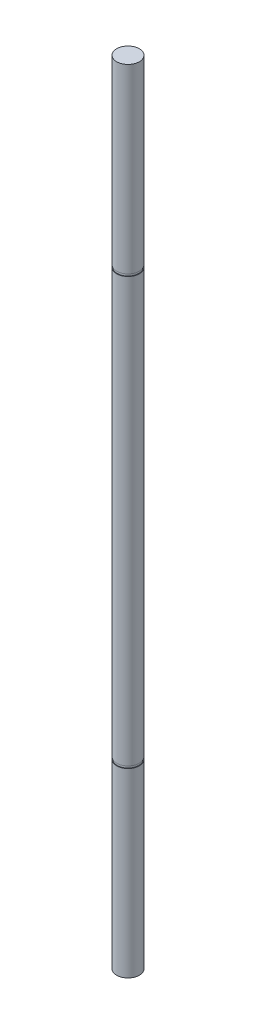
ISO-10303-21;
HEADER;
FILE_DESCRIPTION(('STEP AP214'),'2;1');
FILE_NAME('part.step','',(''),(''),'','','');
FILE_SCHEMA(('AUTOMOTIVE_DESIGN { 1 0 10303 214 1 1 1 1 }'));
ENDSEC;
DATA;
#1=APPLICATION_CONTEXT('core data for automotive mechanical design processes');
#2=APPLICATION_PROTOCOL_DEFINITION('international standard','automotive_design',2000,#1);
#3=PRODUCT_CONTEXT('',#1,'mechanical');
#4=PRODUCT('Part','Part','',(#3));
#5=PRODUCT_RELATED_PRODUCT_CATEGORY('part','',(#4));
#6=PRODUCT_DEFINITION_FORMATION('','',#4);
#7=PRODUCT_DEFINITION_CONTEXT('part definition',#1,'design');
#8=PRODUCT_DEFINITION('design','',#6,#7);
#9=PRODUCT_DEFINITION_SHAPE('','',#8);
#10=(LENGTH_UNIT() NAMED_UNIT(*) SI_UNIT(.MILLI.,.METRE.));
#11=(NAMED_UNIT(*) PLANE_ANGLE_UNIT() SI_UNIT($,.RADIAN.));
#12=(NAMED_UNIT(*) SI_UNIT($,.STERADIAN.) SOLID_ANGLE_UNIT());
#13=UNCERTAINTY_MEASURE_WITH_UNIT(LENGTH_MEASURE(1.E-05),#10,'distance_accuracy_value','');
#14=(GEOMETRIC_REPRESENTATION_CONTEXT(3) GLOBAL_UNCERTAINTY_ASSIGNED_CONTEXT((#13)) GLOBAL_UNIT_ASSIGNED_CONTEXT((#10,
#11,#12)) REPRESENTATION_CONTEXT('',''));
#15=CARTESIAN_POINT('',(0.,0.,0.));
#16=DIRECTION('',(0.,0.,1.));
#17=DIRECTION('',(1.,0.,0.));
#18=AXIS2_PLACEMENT_3D('',#15,#16,#17);
#19=CARTESIAN_POINT('',(0.,140.,0.));
#20=DIRECTION('',(0.,-1.,0.));
#21=DIRECTION('',(0.,0.,-1.));
#22=AXIS2_PLACEMENT_3D('',#19,#20,#21);
#23=CYLINDRICAL_SURFACE('',#22,4.);
#24=CARTESIAN_POINT('',(0.,75.,0.));
#25=DIRECTION('',(0.,1.,0.));
#26=DIRECTION('',(0.,0.,1.));
#27=AXIS2_PLACEMENT_3D('',#24,#25,#26);
#28=CIRCLE('',#27,4.);
#29=CARTESIAN_POINT('',(0.,75.,4.));
#30=VERTEX_POINT('',#29);
#31=EDGE_CURVE('E54',#30,#30,#28,.T.);
#32=ORIENTED_EDGE('',*,*,#31,.F.);
#33=EDGE_LOOP('',(#32));
#34=FACE_BOUND('',#33,.T.);
#35=CARTESIAN_POINT('',(0.,-75.,0.));
#36=DIRECTION('',(0.,-1.,0.));
#37=DIRECTION('',(0.,0.,-1.));
#38=AXIS2_PLACEMENT_3D('',#35,#36,#37);
#39=CIRCLE('',#38,4.);
#40=CARTESIAN_POINT('',(0.,-75.,-4.));
#41=VERTEX_POINT('',#40);
#42=EDGE_CURVE('E58',#41,#41,#39,.T.);
#43=ORIENTED_EDGE('',*,*,#42,.F.);
#44=EDGE_LOOP('',(#43));
#45=FACE_BOUND('',#44,.T.);
#46=ADVANCED_FACE('F35',(#34,#45),#23,.T.);
#47=CARTESIAN_POINT('',(0.,140.,0.));
#48=DIRECTION('',(0.,1.,0.));
#49=DIRECTION('',(0.,0.,1.));
#50=AXIS2_PLACEMENT_3D('',#47,#48,#49);
#51=CIRCLE('',#50,4.);
#52=CARTESIAN_POINT('',(0.,140.,4.));
#53=VERTEX_POINT('',#52);
#54=EDGE_CURVE('E10',#53,#53,#51,.T.);
#55=ORIENTED_EDGE('',*,*,#54,.F.);
#56=EDGE_LOOP('',(#55));
#57=FACE_BOUND('',#56,.T.);
#58=CARTESIAN_POINT('',(0.,75.8,0.));
#59=DIRECTION('',(0.,-1.,0.));
#60=DIRECTION('',(0.,0.,-1.));
#61=AXIS2_PLACEMENT_3D('',#58,#59,#60);
#62=CIRCLE('',#61,4.);
#63=CARTESIAN_POINT('',(0.,75.8,-4.));
#64=VERTEX_POINT('',#63);
#65=EDGE_CURVE('E48',#64,#64,#62,.T.);
#66=ORIENTED_EDGE('',*,*,#65,.F.);
#67=EDGE_LOOP('',(#66));
#68=FACE_BOUND('',#67,.T.);
#69=ADVANCED_FACE('F37',(#57,#68),#23,.T.);
#70=CARTESIAN_POINT('',(0.,140.,0.));
#71=DIRECTION('',(0.,1.,0.));
#72=DIRECTION('',(0.,0.,1.));
#73=AXIS2_PLACEMENT_3D('',#70,#71,#72);
#74=PLANE('',#73);
#75=ORIENTED_EDGE('',*,*,#54,.T.);
#76=EDGE_LOOP('',(#75));
#77=FACE_BOUND('',#76,.T.);
#78=ADVANCED_FACE('F102',(#77),#74,.T.);
#79=CARTESIAN_POINT('',(0.,75.8,-3.79999999999999));
#80=DIRECTION('',(0.,-1.,0.));
#81=DIRECTION('',(0.,0.,-1.));
#82=AXIS2_PLACEMENT_3D('',#79,#80,#81);
#83=PLANE('',#82);
#84=CARTESIAN_POINT('',(0.,75.8,0.));
#85=DIRECTION('',(0.,1.,0.));
#86=DIRECTION('',(0.,0.,1.));
#87=AXIS2_PLACEMENT_3D('',#84,#85,#86);
#88=CIRCLE('',#87,3.79999999999999);
#89=CARTESIAN_POINT('',(0.,75.8,3.79999999999999));
#90=VERTEX_POINT('',#89);
#91=EDGE_CURVE('E51',#90,#90,#88,.T.);
#92=ORIENTED_EDGE('',*,*,#91,.T.);
#93=EDGE_LOOP('',(#92));
#94=FACE_BOUND('',#93,.T.);
#95=ORIENTED_EDGE('',*,*,#65,.T.);
#96=EDGE_LOOP('',(#95));
#97=FACE_BOUND('',#96,.T.);
#98=ADVANCED_FACE('F78',(#94,#97),#83,.T.);
#99=CARTESIAN_POINT('',(0.,75.,-3.79999999999999));
#100=DIRECTION('',(0.,1.,0.));
#101=DIRECTION('',(0.,0.,1.));
#102=AXIS2_PLACEMENT_3D('',#99,#100,#101);
#103=PLANE('',#102);
#104=CARTESIAN_POINT('',(0.,75.,0.));
#105=DIRECTION('',(0.,1.,0.));
#106=DIRECTION('',(0.,0.,1.));
#107=AXIS2_PLACEMENT_3D('',#104,#105,#106);
#108=CIRCLE('',#107,3.79999999999999);
#109=CARTESIAN_POINT('',(0.,75.,3.79999999999999));
#110=VERTEX_POINT('',#109);
#111=EDGE_CURVE('E64',#110,#110,#108,.T.);
#112=ORIENTED_EDGE('',*,*,#111,.F.);
#113=EDGE_LOOP('',(#112));
#114=FACE_BOUND('',#113,.T.);
#115=ORIENTED_EDGE('',*,*,#31,.T.);
#116=EDGE_LOOP('',(#115));
#117=FACE_BOUND('',#116,.T.);
#118=ADVANCED_FACE('F84',(#114,#117),#103,.T.);
#119=CARTESIAN_POINT('',(0.,140.,0.));
#120=DIRECTION('',(0.,1.,0.));
#121=DIRECTION('',(0.,0.,1.));
#122=AXIS2_PLACEMENT_3D('',#119,#120,#121);
#123=CYLINDRICAL_SURFACE('',#122,3.79999999999999);
#124=ORIENTED_EDGE('',*,*,#111,.T.);
#125=EDGE_LOOP('',(#124));
#126=FACE_BOUND('',#125,.T.);
#127=ORIENTED_EDGE('',*,*,#91,.F.);
#128=EDGE_LOOP('',(#127));
#129=FACE_BOUND('',#128,.T.);
#130=ADVANCED_FACE('F81',(#126,#129),#123,.T.);
#131=CARTESIAN_POINT('',(0.,-75.8,-3.79999999999999));
#132=DIRECTION('',(0.,1.,0.));
#133=DIRECTION('',(0.,0.,-1.));
#134=AXIS2_PLACEMENT_3D('',#131,#132,#133);
#135=PLANE('',#134);
#136=CARTESIAN_POINT('',(0.,-75.8,0.));
#137=DIRECTION('',(0.,1.,0.));
#138=DIRECTION('',(0.,0.,1.));
#139=AXIS2_PLACEMENT_3D('',#136,#137,#138);
#140=CIRCLE('',#139,3.79999999999999);
#141=CARTESIAN_POINT('',(0.,-75.8,3.79999999999999));
#142=VERTEX_POINT('',#141);
#143=EDGE_CURVE('E60',#142,#142,#140,.T.);
#144=ORIENTED_EDGE('',*,*,#143,.F.);
#145=EDGE_LOOP('',(#144));
#146=FACE_BOUND('',#145,.T.);
#147=CARTESIAN_POINT('',(0.,-75.8,0.));
#148=DIRECTION('',(0.,1.,0.));
#149=DIRECTION('',(0.,0.,1.));
#150=AXIS2_PLACEMENT_3D('',#147,#148,#149);
#151=CIRCLE('',#150,4.);
#152=CARTESIAN_POINT('',(0.,-75.8,4.));
#153=VERTEX_POINT('',#152);
#154=EDGE_CURVE('E39',#153,#153,#151,.T.);
#155=ORIENTED_EDGE('',*,*,#154,.T.);
#156=EDGE_LOOP('',(#155));
#157=FACE_BOUND('',#156,.T.);
#158=ADVANCED_FACE('F83',(#146,#157),#135,.T.);
#159=CARTESIAN_POINT('',(0.,-75.,-3.79999999999999));
#160=DIRECTION('',(0.,-1.,0.));
#161=DIRECTION('',(0.,0.,1.));
#162=AXIS2_PLACEMENT_3D('',#159,#160,#161);
#163=PLANE('',#162);
#164=CARTESIAN_POINT('',(0.,-75.,0.));
#165=DIRECTION('',(0.,1.,0.));
#166=DIRECTION('',(0.,0.,1.));
#167=AXIS2_PLACEMENT_3D('',#164,#165,#166);
#168=CIRCLE('',#167,3.79999999999999);
#169=CARTESIAN_POINT('',(0.,-75.,3.79999999999999));
#170=VERTEX_POINT('',#169);
#171=EDGE_CURVE('E66',#170,#170,#168,.T.);
#172=ORIENTED_EDGE('',*,*,#171,.T.);
#173=EDGE_LOOP('',(#172));
#174=FACE_BOUND('',#173,.T.);
#175=ORIENTED_EDGE('',*,*,#42,.T.);
#176=EDGE_LOOP('',(#175));
#177=FACE_BOUND('',#176,.T.);
#178=ADVANCED_FACE('F90',(#174,#177),#163,.T.);
#179=CARTESIAN_POINT('',(0.,-140.,0.));
#180=DIRECTION('',(0.,-1.,0.));
#181=DIRECTION('',(0.,0.,1.));
#182=AXIS2_PLACEMENT_3D('',#179,#180,#181);
#183=CYLINDRICAL_SURFACE('',#182,3.79999999999999);
#184=ORIENTED_EDGE('',*,*,#171,.F.);
#185=EDGE_LOOP('',(#184));
#186=FACE_BOUND('',#185,.T.);
#187=ORIENTED_EDGE('',*,*,#143,.T.);
#188=EDGE_LOOP('',(#187));
#189=FACE_BOUND('',#188,.T.);
#190=ADVANCED_FACE('F112',(#186,#189),#183,.T.);
#191=CARTESIAN_POINT('',(0.,-140.,0.));
#192=DIRECTION('',(0.,1.,0.));
#193=DIRECTION('',(0.,0.,1.));
#194=AXIS2_PLACEMENT_3D('',#191,#192,#193);
#195=PLANE('',#194);
#196=CARTESIAN_POINT('',(0.,-140.,0.));
#197=DIRECTION('',(0.,1.,0.));
#198=DIRECTION('',(0.,0.,1.));
#199=AXIS2_PLACEMENT_3D('',#196,#197,#198);
#200=CIRCLE('',#199,4.);
#201=CARTESIAN_POINT('',(0.,-140.,4.));
#202=VERTEX_POINT('',#201);
#203=EDGE_CURVE('E43',#202,#202,#200,.T.);
#204=ORIENTED_EDGE('',*,*,#203,.F.);
#205=EDGE_LOOP('',(#204));
#206=FACE_BOUND('',#205,.T.);
#207=ADVANCED_FACE('F107',(#206),#195,.F.);
#208=ORIENTED_EDGE('',*,*,#203,.T.);
#209=EDGE_LOOP('',(#208));
#210=FACE_BOUND('',#209,.T.);
#211=ORIENTED_EDGE('',*,*,#154,.F.);
#212=EDGE_LOOP('',(#211));
#213=FACE_BOUND('',#212,.T.);
#214=ADVANCED_FACE('F98',(#210,#213),#23,.T.);
#215=CLOSED_SHELL('',(#46,#69,#78,#98,#118,#130,#158,#178,#190,#207,#214));
#216=MANIFOLD_SOLID_BREP('B2',#215);
#217=ADVANCED_BREP_SHAPE_REPRESENTATION('',(#18,#216),#14);
#218=SHAPE_DEFINITION_REPRESENTATION(#9,#217);
ENDSEC;
END-ISO-10303-21;
